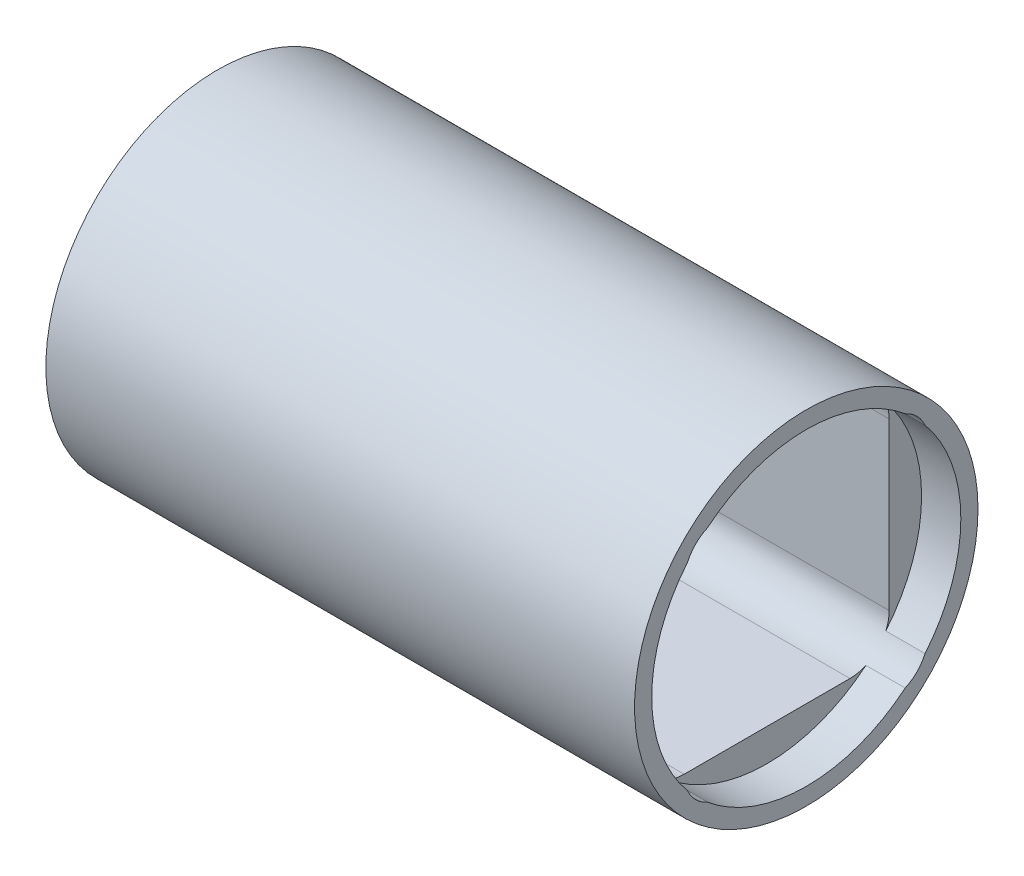
ISO-10303-21;
HEADER;
FILE_DESCRIPTION(('STEP AP214'),'2;1');
FILE_NAME('part.step','',(''),(''),'','','');
FILE_SCHEMA(('AUTOMOTIVE_DESIGN { 1 0 10303 214 1 1 1 1 }'));
ENDSEC;
DATA;
#1=APPLICATION_CONTEXT('core data for automotive mechanical design processes');
#2=APPLICATION_PROTOCOL_DEFINITION('international standard','automotive_design',2000,#1);
#3=PRODUCT_CONTEXT('',#1,'mechanical');
#4=PRODUCT('Part','Part','',(#3));
#5=PRODUCT_RELATED_PRODUCT_CATEGORY('part','',(#4));
#6=PRODUCT_DEFINITION_FORMATION('','',#4);
#7=PRODUCT_DEFINITION_CONTEXT('part definition',#1,'design');
#8=PRODUCT_DEFINITION('design','',#6,#7);
#9=PRODUCT_DEFINITION_SHAPE('','',#8);
#10=(LENGTH_UNIT() NAMED_UNIT(*) SI_UNIT(.MILLI.,.METRE.));
#11=(NAMED_UNIT(*) PLANE_ANGLE_UNIT() SI_UNIT($,.RADIAN.));
#12=(NAMED_UNIT(*) SI_UNIT($,.STERADIAN.) SOLID_ANGLE_UNIT());
#13=UNCERTAINTY_MEASURE_WITH_UNIT(LENGTH_MEASURE(1.E-05),#10,'distance_accuracy_value','');
#14=(GEOMETRIC_REPRESENTATION_CONTEXT(3) GLOBAL_UNCERTAINTY_ASSIGNED_CONTEXT((#13)) GLOBAL_UNIT_ASSIGNED_CONTEXT((#10,
#11,#12)) REPRESENTATION_CONTEXT('',''));
#15=CARTESIAN_POINT('',(0.,0.,0.));
#16=DIRECTION('',(0.,0.,1.));
#17=DIRECTION('',(1.,0.,0.));
#18=AXIS2_PLACEMENT_3D('',#15,#16,#17);
#19=CARTESIAN_POINT('',(56.,0.,0.));
#20=DIRECTION('',(1.,0.,0.));
#21=DIRECTION('',(0.,0.,-1.));
#22=AXIS2_PLACEMENT_3D('',#19,#20,#21);
#23=CYLINDRICAL_SURFACE('',#22,15.75);
#24=DIRECTION('',(-1.,0.,0.));
#25=VECTOR('',#24,1.);
#26=CARTESIAN_POINT('',(56.,10.0776325306588,12.1038763450808));
#27=LINE('',#26,#25);
#28=CARTESIAN_POINT('',(60.,10.0776325306588,12.1038763450808));
#29=VERTEX_POINT('',#28);
#30=CARTESIAN_POINT('',(56.,10.0776325306588,12.1038763450808));
#31=VERTEX_POINT('',#30);
#32=EDGE_CURVE('E264',#29,#31,#27,.T.);
#33=ORIENTED_EDGE('',*,*,#32,.F.);
#34=CARTESIAN_POINT('',(60.,0.,0.));
#35=DIRECTION('',(1.,0.,0.));
#36=DIRECTION('',(0.,0.,-1.));
#37=AXIS2_PLACEMENT_3D('',#34,#35,#36);
#38=CIRCLE('',#37,15.75);
#39=CARTESIAN_POINT('',(60.,-10.0776325306588,12.1038763450808));
#40=VERTEX_POINT('',#39);
#41=EDGE_CURVE('E398',#29,#40,#38,.T.);
#42=ORIENTED_EDGE('',*,*,#41,.T.);
#43=DIRECTION('',(-1.,0.,0.));
#44=VECTOR('',#43,1.);
#45=CARTESIAN_POINT('',(56.,-10.0776325306588,12.1038763450808));
#46=LINE('',#45,#44);
#47=CARTESIAN_POINT('',(56.,-10.0776325306588,12.1038763450808));
#48=VERTEX_POINT('',#47);
#49=EDGE_CURVE('E252',#48,#40,#46,.F.);
#50=ORIENTED_EDGE('',*,*,#49,.F.);
#51=CARTESIAN_POINT('',(56.,0.,0.));
#52=DIRECTION('',(1.,0.,0.));
#53=DIRECTION('',(0.,0.,-1.));
#54=AXIS2_PLACEMENT_3D('',#51,#52,#53);
#55=CIRCLE('',#54,15.75);
#56=EDGE_CURVE('E374',#31,#48,#55,.T.);
#57=ORIENTED_EDGE('',*,*,#56,.F.);
#58=EDGE_LOOP('',(#33,#42,#50,#57));
#59=FACE_BOUND('',#58,.T.);
#60=ADVANCED_FACE('F33',(#59),#23,.F.);
#61=DIRECTION('',(-1.,0.,0.));
#62=VECTOR('',#61,1.);
#63=CARTESIAN_POINT('',(56.,12.1038763450808,10.0776325306588));
#64=LINE('',#63,#62);
#65=CARTESIAN_POINT('',(56.,12.1038763450808,10.0776325306588));
#66=VERTEX_POINT('',#65);
#67=CARTESIAN_POINT('',(60.,12.1038763450808,10.0776325306588));
#68=VERTEX_POINT('',#67);
#69=EDGE_CURVE('E259',#66,#68,#64,.F.);
#70=ORIENTED_EDGE('',*,*,#69,.F.);
#71=CARTESIAN_POINT('',(56.,12.1038763450808,-10.0776325306588));
#72=VERTEX_POINT('',#71);
#73=EDGE_CURVE('E272',#72,#66,#55,.T.);
#74=ORIENTED_EDGE('',*,*,#73,.F.);
#75=DIRECTION('',(-1.,0.,0.));
#76=VECTOR('',#75,1.);
#77=CARTESIAN_POINT('',(56.,12.1038763450808,-10.0776325306588));
#78=LINE('',#77,#76);
#79=CARTESIAN_POINT('',(60.,12.1038763450808,-10.0776325306588));
#80=VERTEX_POINT('',#79);
#81=EDGE_CURVE('E243',#80,#72,#78,.T.);
#82=ORIENTED_EDGE('',*,*,#81,.F.);
#83=EDGE_CURVE('E271',#80,#68,#38,.T.);
#84=ORIENTED_EDGE('',*,*,#83,.T.);
#85=EDGE_LOOP('',(#70,#74,#82,#84));
#86=FACE_BOUND('',#85,.T.);
#87=ADVANCED_FACE('F331',(#86),#23,.F.);
#88=DIRECTION('',(-1.,0.,0.));
#89=VECTOR('',#88,1.);
#90=CARTESIAN_POINT('',(56.,-12.1038763450808,10.0776325306588));
#91=LINE('',#90,#89);
#92=CARTESIAN_POINT('',(60.,-12.1038763450808,10.0776325306588));
#93=VERTEX_POINT('',#92);
#94=CARTESIAN_POINT('',(56.,-12.1038763450808,10.0776325306588));
#95=VERTEX_POINT('',#94);
#96=EDGE_CURVE('E257',#93,#95,#91,.T.);
#97=ORIENTED_EDGE('',*,*,#96,.F.);
#98=CARTESIAN_POINT('',(60.,-12.1038763450808,-10.0776325306588));
#99=VERTEX_POINT('',#98);
#100=EDGE_CURVE('E275',#93,#99,#38,.T.);
#101=ORIENTED_EDGE('',*,*,#100,.T.);
#102=DIRECTION('',(-1.,0.,0.));
#103=VECTOR('',#102,1.);
#104=CARTESIAN_POINT('',(56.,-12.1038763450808,-10.0776325306588));
#105=LINE('',#104,#103);
#106=CARTESIAN_POINT('',(56.,-12.1038763450808,-10.0776325306588));
#107=VERTEX_POINT('',#106);
#108=EDGE_CURVE('E245',#107,#99,#105,.F.);
#109=ORIENTED_EDGE('',*,*,#108,.F.);
#110=EDGE_CURVE('E270',#95,#107,#55,.T.);
#111=ORIENTED_EDGE('',*,*,#110,.F.);
#112=EDGE_LOOP('',(#97,#101,#109,#111));
#113=FACE_BOUND('',#112,.T.);
#114=ADVANCED_FACE('F338',(#113),#23,.F.);
#115=DIRECTION('',(-1.,0.,0.));
#116=VECTOR('',#115,1.);
#117=CARTESIAN_POINT('',(56.,-10.0776325306588,-12.1038763450808));
#118=LINE('',#117,#116);
#119=CARTESIAN_POINT('',(60.,-10.0776325306588,-12.1038763450808));
#120=VERTEX_POINT('',#119);
#121=CARTESIAN_POINT('',(56.,-10.0776325306588,-12.1038763450808));
#122=VERTEX_POINT('',#121);
#123=EDGE_CURVE('E250',#120,#122,#118,.T.);
#124=ORIENTED_EDGE('',*,*,#123,.F.);
#125=CARTESIAN_POINT('',(60.,10.0776325306588,-12.1038763450808));
#126=VERTEX_POINT('',#125);
#127=EDGE_CURVE('E266',#120,#126,#38,.T.);
#128=ORIENTED_EDGE('',*,*,#127,.T.);
#129=DIRECTION('',(-1.,0.,0.));
#130=VECTOR('',#129,1.);
#131=CARTESIAN_POINT('',(56.,10.0776325306588,-12.1038763450808));
#132=LINE('',#131,#130);
#133=CARTESIAN_POINT('',(56.,10.0776325306588,-12.1038763450808));
#134=VERTEX_POINT('',#133);
#135=EDGE_CURVE('E238',#134,#126,#132,.F.);
#136=ORIENTED_EDGE('',*,*,#135,.F.);
#137=EDGE_CURVE('E267',#122,#134,#55,.T.);
#138=ORIENTED_EDGE('',*,*,#137,.F.);
#139=EDGE_LOOP('',(#124,#128,#136,#138));
#140=FACE_BOUND('',#139,.T.);
#141=ADVANCED_FACE('F334',(#140),#23,.F.);
#142=CARTESIAN_POINT('',(56.,0.,0.));
#143=DIRECTION('',(1.,0.,0.));
#144=DIRECTION('',(0.,0.,-1.));
#145=AXIS2_PLACEMENT_3D('',#142,#143,#144);
#146=PLANE('',#145);
#147=DIRECTION('',(0.,1.,0.));
#148=VECTOR('',#147,1.);
#149=CARTESIAN_POINT('',(56.,0.,12.45));
#150=LINE('',#149,#148);
#151=CARTESIAN_POINT('',(56.,-8.45,12.45));
#152=VERTEX_POINT('',#151);
#153=CARTESIAN_POINT('',(56.,8.45,12.45));
#154=VERTEX_POINT('',#153);
#155=EDGE_CURVE('E307',#152,#154,#150,.T.);
#156=ORIENTED_EDGE('',*,*,#155,.T.);
#157=CARTESIAN_POINT('',(56.,8.45,8.45));
#158=DIRECTION('',(1.,0.,0.));
#159=DIRECTION('',(0.,0.,-1.));
#160=AXIS2_PLACEMENT_3D('',#157,#158,#159);
#161=CIRCLE('',#160,4.);
#162=EDGE_CURVE('E292',#154,#31,#161,.F.);
#163=ORIENTED_EDGE('',*,*,#162,.T.);
#164=ORIENTED_EDGE('',*,*,#56,.T.);
#165=CARTESIAN_POINT('',(56.,-8.45,8.45));
#166=DIRECTION('',(1.,0.,0.));
#167=DIRECTION('',(0.,0.,-1.));
#168=AXIS2_PLACEMENT_3D('',#165,#166,#167);
#169=CIRCLE('',#168,4.);
#170=EDGE_CURVE('E306',#48,#152,#169,.F.);
#171=ORIENTED_EDGE('',*,*,#170,.T.);
#172=EDGE_LOOP('',(#156,#163,#164,#171));
#173=FACE_BOUND('',#172,.T.);
#174=ADVANCED_FACE('F344',(#173),#146,.T.);
#175=DIRECTION('',(0.,0.,1.));
#176=VECTOR('',#175,1.);
#177=CARTESIAN_POINT('',(56.,-12.45,0.));
#178=LINE('',#177,#176);
#179=CARTESIAN_POINT('',(56.,-12.45,-8.45));
#180=VERTEX_POINT('',#179);
#181=CARTESIAN_POINT('',(56.,-12.45,8.45));
#182=VERTEX_POINT('',#181);
#183=EDGE_CURVE('E300',#180,#182,#178,.T.);
#184=ORIENTED_EDGE('',*,*,#183,.T.);
#185=EDGE_CURVE('E303',#182,#95,#169,.F.);
#186=ORIENTED_EDGE('',*,*,#185,.T.);
#187=ORIENTED_EDGE('',*,*,#110,.T.);
#188=CARTESIAN_POINT('',(56.,-8.45,-8.45));
#189=DIRECTION('',(1.,0.,0.));
#190=DIRECTION('',(0.,0.,-1.));
#191=AXIS2_PLACEMENT_3D('',#188,#189,#190);
#192=CIRCLE('',#191,4.);
#193=EDGE_CURVE('E299',#107,#180,#192,.F.);
#194=ORIENTED_EDGE('',*,*,#193,.T.);
#195=EDGE_LOOP('',(#184,#186,#187,#194));
#196=FACE_BOUND('',#195,.T.);
#197=ADVANCED_FACE('F350',(#196),#146,.T.);
#198=DIRECTION('',(0.,-1.,0.));
#199=VECTOR('',#198,1.);
#200=CARTESIAN_POINT('',(56.,0.,-12.45));
#201=LINE('',#200,#199);
#202=CARTESIAN_POINT('',(56.,8.45,-12.45));
#203=VERTEX_POINT('',#202);
#204=CARTESIAN_POINT('',(56.,-8.45,-12.45));
#205=VERTEX_POINT('',#204);
#206=EDGE_CURVE('E293',#203,#205,#201,.T.);
#207=ORIENTED_EDGE('',*,*,#206,.T.);
#208=EDGE_CURVE('E296',#205,#122,#192,.F.);
#209=ORIENTED_EDGE('',*,*,#208,.T.);
#210=ORIENTED_EDGE('',*,*,#137,.T.);
#211=CARTESIAN_POINT('',(56.,8.45,-8.45));
#212=DIRECTION('',(1.,0.,0.));
#213=DIRECTION('',(0.,0.,-1.));
#214=AXIS2_PLACEMENT_3D('',#211,#212,#213);
#215=CIRCLE('',#214,4.);
#216=EDGE_CURVE('E289',#134,#203,#215,.F.);
#217=ORIENTED_EDGE('',*,*,#216,.T.);
#218=EDGE_LOOP('',(#207,#209,#210,#217));
#219=FACE_BOUND('',#218,.T.);
#220=ADVANCED_FACE('F416',(#219),#146,.T.);
#221=ORIENTED_EDGE('',*,*,#73,.T.);
#222=CARTESIAN_POINT('',(56.,12.45,8.45));
#223=VERTEX_POINT('',#222);
#224=EDGE_CURVE('E288',#66,#223,#161,.F.);
#225=ORIENTED_EDGE('',*,*,#224,.T.);
#226=DIRECTION('',(0.,0.,-1.));
#227=VECTOR('',#226,1.);
#228=CARTESIAN_POINT('',(56.,12.45,0.));
#229=LINE('',#228,#227);
#230=CARTESIAN_POINT('',(56.,12.45,-8.45));
#231=VERTEX_POINT('',#230);
#232=EDGE_CURVE('E282',#223,#231,#229,.T.);
#233=ORIENTED_EDGE('',*,*,#232,.T.);
#234=EDGE_CURVE('E285',#231,#72,#215,.F.);
#235=ORIENTED_EDGE('',*,*,#234,.T.);
#236=EDGE_LOOP('',(#221,#225,#233,#235));
#237=FACE_BOUND('',#236,.T.);
#238=ADVANCED_FACE('F352',(#237),#146,.T.);
#239=CARTESIAN_POINT('',(0.,0.,0.));
#240=DIRECTION('',(-1.,0.,0.));
#241=DIRECTION('',(0.,0.,1.));
#242=AXIS2_PLACEMENT_3D('',#239,#240,#241);
#243=PLANE('',#242);
#244=DIRECTION('',(0.,1.,0.));
#245=VECTOR('',#244,1.);
#246=CARTESIAN_POINT('',(0.,8.,2.));
#247=LINE('',#246,#245);
#248=CARTESIAN_POINT('',(0.,5.65685424949238,2.));
#249=VERTEX_POINT('',#248);
#250=CARTESIAN_POINT('',(0.,8.,2.));
#251=VERTEX_POINT('',#250);
#252=EDGE_CURVE('E175',#249,#251,#247,.T.);
#253=ORIENTED_EDGE('',*,*,#252,.F.);
#254=CARTESIAN_POINT('',(0.,0.,0.));
#255=DIRECTION('',(-1.,0.,0.));
#256=DIRECTION('',(0.,0.,1.));
#257=AXIS2_PLACEMENT_3D('',#254,#255,#256);
#258=CIRCLE('',#257,6.);
#259=CARTESIAN_POINT('',(0.,5.65685424949238,-2.));
#260=VERTEX_POINT('',#259);
#261=EDGE_CURVE('E188',#260,#249,#258,.T.);
#262=ORIENTED_EDGE('',*,*,#261,.F.);
#263=DIRECTION('',(0.,-1.,0.));
#264=VECTOR('',#263,1.);
#265=CARTESIAN_POINT('',(0.,8.,-2.));
#266=LINE('',#265,#264);
#267=CARTESIAN_POINT('',(0.,8.,-2.));
#268=VERTEX_POINT('',#267);
#269=EDGE_CURVE('E48',#268,#260,#266,.T.);
#270=ORIENTED_EDGE('',*,*,#269,.F.);
#271=DIRECTION('',(0.,0.,-1.));
#272=VECTOR('',#271,1.);
#273=CARTESIAN_POINT('',(0.,8.,-2.));
#274=LINE('',#273,#272);
#275=EDGE_CURVE('E178',#251,#268,#274,.T.);
#276=ORIENTED_EDGE('',*,*,#275,.F.);
#277=EDGE_LOOP('',(#253,#262,#270,#276));
#278=FACE_BOUND('',#277,.T.);
#279=CARTESIAN_POINT('',(0.,0.,0.));
#280=DIRECTION('',(1.,0.,0.));
#281=DIRECTION('',(0.,0.,-1.));
#282=AXIS2_PLACEMENT_3D('',#279,#280,#281);
#283=CIRCLE('',#282,17.5);
#284=CARTESIAN_POINT('',(0.,0.,-17.5));
#285=VERTEX_POINT('',#284);
#286=EDGE_CURVE('E279',#285,#285,#283,.T.);
#287=ORIENTED_EDGE('',*,*,#286,.F.);
#288=EDGE_LOOP('',(#287));
#289=FACE_BOUND('',#288,.T.);
#290=ADVANCED_FACE('F35',(#278,#289),#243,.T.);
#291=CARTESIAN_POINT('',(0.,0.,0.));
#292=DIRECTION('',(1.,0.,0.));
#293=DIRECTION('',(0.,0.,-1.));
#294=AXIS2_PLACEMENT_3D('',#291,#292,#293);
#295=CYLINDRICAL_SURFACE('',#294,17.5);
#296=ORIENTED_EDGE('',*,*,#286,.T.);
#297=EDGE_LOOP('',(#296));
#298=FACE_BOUND('',#297,.T.);
#299=CARTESIAN_POINT('',(60.,0.,0.));
#300=DIRECTION('',(1.,0.,0.));
#301=DIRECTION('',(0.,0.,-1.));
#302=AXIS2_PLACEMENT_3D('',#299,#300,#301);
#303=CIRCLE('',#302,17.5);
#304=CARTESIAN_POINT('',(60.,0.,-17.5));
#305=VERTEX_POINT('',#304);
#306=EDGE_CURVE('E276',#305,#305,#303,.T.);
#307=ORIENTED_EDGE('',*,*,#306,.F.);
#308=EDGE_LOOP('',(#307));
#309=FACE_BOUND('',#308,.T.);
#310=ADVANCED_FACE('F555',(#298,#309),#295,.T.);
#311=CARTESIAN_POINT('',(60.,17.5,0.));
#312=DIRECTION('',(1.,0.,0.));
#313=DIRECTION('',(0.,0.,-1.));
#314=AXIS2_PLACEMENT_3D('',#311,#312,#313);
#315=PLANE('',#314);
#316=ORIENTED_EDGE('',*,*,#41,.F.);
#317=CARTESIAN_POINT('',(60.,8.45,8.45));
#318=DIRECTION('',(1.,0.,0.));
#319=DIRECTION('',(0.,0.,-1.));
#320=AXIS2_PLACEMENT_3D('',#317,#318,#319);
#321=CIRCLE('',#320,4.);
#322=EDGE_CURVE('E261',#29,#68,#321,.F.);
#323=ORIENTED_EDGE('',*,*,#322,.T.);
#324=ORIENTED_EDGE('',*,*,#83,.F.);
#325=CARTESIAN_POINT('',(60.,8.45,-8.45));
#326=DIRECTION('',(1.,0.,0.));
#327=DIRECTION('',(0.,0.,-1.));
#328=AXIS2_PLACEMENT_3D('',#325,#326,#327);
#329=CIRCLE('',#328,4.);
#330=EDGE_CURVE('E240',#80,#126,#329,.F.);
#331=ORIENTED_EDGE('',*,*,#330,.T.);
#332=ORIENTED_EDGE('',*,*,#127,.F.);
#333=CARTESIAN_POINT('',(60.,-8.45,-8.45));
#334=DIRECTION('',(1.,0.,0.));
#335=DIRECTION('',(0.,0.,-1.));
#336=AXIS2_PLACEMENT_3D('',#333,#334,#335);
#337=CIRCLE('',#336,4.);
#338=EDGE_CURVE('E247',#120,#99,#337,.F.);
#339=ORIENTED_EDGE('',*,*,#338,.T.);
#340=ORIENTED_EDGE('',*,*,#100,.F.);
#341=CARTESIAN_POINT('',(60.,-8.45,8.45));
#342=DIRECTION('',(1.,0.,0.));
#343=DIRECTION('',(0.,0.,-1.));
#344=AXIS2_PLACEMENT_3D('',#341,#342,#343);
#345=CIRCLE('',#344,4.);
#346=EDGE_CURVE('E254',#93,#40,#345,.F.);
#347=ORIENTED_EDGE('',*,*,#346,.T.);
#348=EDGE_LOOP('',(#316,#323,#324,#331,#332,#339,#340,#347));
#349=FACE_BOUND('',#348,.T.);
#350=ORIENTED_EDGE('',*,*,#306,.T.);
#351=EDGE_LOOP('',(#350));
#352=FACE_BOUND('',#351,.T.);
#353=ADVANCED_FACE('F361',(#349,#352),#315,.T.);
#354=CARTESIAN_POINT('',(81.,8.45,8.45));
#355=DIRECTION('',(-1.,0.,0.));
#356=DIRECTION('',(0.,0.,1.));
#357=AXIS2_PLACEMENT_3D('',#354,#355,#356);
#358=CYLINDRICAL_SURFACE('',#357,4.);
#359=DIRECTION('',(-1.,0.,0.));
#360=VECTOR('',#359,1.);
#361=CARTESIAN_POINT('',(81.,8.45,12.45));
#362=LINE('',#361,#360);
#363=CARTESIAN_POINT('',(31.,8.45,12.45));
#364=VERTEX_POINT('',#363);
#365=EDGE_CURVE('E236',#154,#364,#362,.T.);
#366=ORIENTED_EDGE('',*,*,#365,.T.);
#367=CARTESIAN_POINT('',(31.,8.45,8.45));
#368=DIRECTION('',(1.,0.,0.));
#369=DIRECTION('',(0.,0.,1.));
#370=AXIS2_PLACEMENT_3D('',#367,#368,#369);
#371=CIRCLE('',#370,4.);
#372=CARTESIAN_POINT('',(31.,12.45,8.45));
#373=VERTEX_POINT('',#372);
#374=EDGE_CURVE('E199',#373,#364,#371,.T.);
#375=ORIENTED_EDGE('',*,*,#374,.F.);
#376=DIRECTION('',(-1.,0.,0.));
#377=VECTOR('',#376,1.);
#378=CARTESIAN_POINT('',(81.,12.45,8.45));
#379=LINE('',#378,#377);
#380=EDGE_CURVE('E223',#223,#373,#379,.T.);
#381=ORIENTED_EDGE('',*,*,#380,.F.);
#382=ORIENTED_EDGE('',*,*,#224,.F.);
#383=ORIENTED_EDGE('',*,*,#69,.T.);
#384=ORIENTED_EDGE('',*,*,#322,.F.);
#385=ORIENTED_EDGE('',*,*,#32,.T.);
#386=ORIENTED_EDGE('',*,*,#162,.F.);
#387=EDGE_LOOP('',(#366,#375,#381,#382,#383,#384,#385,#386));
#388=FACE_BOUND('',#387,.T.);
#389=ADVANCED_FACE('F400',(#388),#358,.F.);
#390=CARTESIAN_POINT('',(81.,8.45,12.45));
#391=DIRECTION('',(0.,0.,-1.));
#392=DIRECTION('',(0.,1.,0.));
#393=AXIS2_PLACEMENT_3D('',#390,#391,#392);
#394=PLANE('',#393);
#395=DIRECTION('',(-1.,0.,0.));
#396=VECTOR('',#395,1.);
#397=CARTESIAN_POINT('',(81.,-8.45,12.45));
#398=LINE('',#397,#396);
#399=CARTESIAN_POINT('',(31.,-8.45,12.45));
#400=VERTEX_POINT('',#399);
#401=EDGE_CURVE('E234',#152,#400,#398,.T.);
#402=ORIENTED_EDGE('',*,*,#401,.T.);
#403=DIRECTION('',(0.,-1.,0.));
#404=VECTOR('',#403,1.);
#405=CARTESIAN_POINT('',(31.,8.45,12.45));
#406=LINE('',#405,#404);
#407=EDGE_CURVE('E202',#364,#400,#406,.T.);
#408=ORIENTED_EDGE('',*,*,#407,.F.);
#409=ORIENTED_EDGE('',*,*,#365,.F.);
#410=ORIENTED_EDGE('',*,*,#155,.F.);
#411=EDGE_LOOP('',(#402,#408,#409,#410));
#412=FACE_BOUND('',#411,.T.);
#413=ADVANCED_FACE('F403',(#412),#394,.T.);
#414=CARTESIAN_POINT('',(81.,-8.45,8.45));
#415=DIRECTION('',(-1.,0.,0.));
#416=DIRECTION('',(0.,0.,1.));
#417=AXIS2_PLACEMENT_3D('',#414,#415,#416);
#418=CYLINDRICAL_SURFACE('',#417,4.);
#419=DIRECTION('',(-1.,0.,0.));
#420=VECTOR('',#419,1.);
#421=CARTESIAN_POINT('',(81.,-12.45,8.45));
#422=LINE('',#421,#420);
#423=CARTESIAN_POINT('',(31.,-12.45,8.45));
#424=VERTEX_POINT('',#423);
#425=EDGE_CURVE('E232',#182,#424,#422,.T.);
#426=ORIENTED_EDGE('',*,*,#425,.T.);
#427=CARTESIAN_POINT('',(31.,-8.45,8.45));
#428=DIRECTION('',(1.,0.,0.));
#429=DIRECTION('',(0.,0.,-1.));
#430=AXIS2_PLACEMENT_3D('',#427,#428,#429);
#431=CIRCLE('',#430,4.);
#432=EDGE_CURVE('E205',#400,#424,#431,.T.);
#433=ORIENTED_EDGE('',*,*,#432,.F.);
#434=ORIENTED_EDGE('',*,*,#401,.F.);
#435=ORIENTED_EDGE('',*,*,#170,.F.);
#436=ORIENTED_EDGE('',*,*,#49,.T.);
#437=ORIENTED_EDGE('',*,*,#346,.F.);
#438=ORIENTED_EDGE('',*,*,#96,.T.);
#439=ORIENTED_EDGE('',*,*,#185,.F.);
#440=EDGE_LOOP('',(#426,#433,#434,#435,#436,#437,#438,#439));
#441=FACE_BOUND('',#440,.T.);
#442=ADVANCED_FACE('F394',(#441),#418,.F.);
#443=CARTESIAN_POINT('',(81.,-12.45,8.45));
#444=DIRECTION('',(0.,1.,0.));
#445=DIRECTION('',(0.,0.,1.));
#446=AXIS2_PLACEMENT_3D('',#443,#444,#445);
#447=PLANE('',#446);
#448=DIRECTION('',(-1.,0.,0.));
#449=VECTOR('',#448,1.);
#450=CARTESIAN_POINT('',(81.,-12.45,-8.45));
#451=LINE('',#450,#449);
#452=CARTESIAN_POINT('',(31.,-12.45,-8.45));
#453=VERTEX_POINT('',#452);
#454=EDGE_CURVE('E230',#180,#453,#451,.T.);
#455=ORIENTED_EDGE('',*,*,#454,.T.);
#456=DIRECTION('',(0.,0.,-1.));
#457=VECTOR('',#456,1.);
#458=CARTESIAN_POINT('',(31.,-12.45,8.45));
#459=LINE('',#458,#457);
#460=EDGE_CURVE('E208',#424,#453,#459,.T.);
#461=ORIENTED_EDGE('',*,*,#460,.F.);
#462=ORIENTED_EDGE('',*,*,#425,.F.);
#463=ORIENTED_EDGE('',*,*,#183,.F.);
#464=EDGE_LOOP('',(#455,#461,#462,#463));
#465=FACE_BOUND('',#464,.T.);
#466=ADVANCED_FACE('F390',(#465),#447,.T.);
#467=CARTESIAN_POINT('',(81.,-8.45,-8.45));
#468=DIRECTION('',(-1.,0.,0.));
#469=DIRECTION('',(0.,0.,1.));
#470=AXIS2_PLACEMENT_3D('',#467,#468,#469);
#471=CYLINDRICAL_SURFACE('',#470,4.);
#472=DIRECTION('',(-1.,0.,0.));
#473=VECTOR('',#472,1.);
#474=CARTESIAN_POINT('',(81.,-8.45,-12.45));
#475=LINE('',#474,#473);
#476=CARTESIAN_POINT('',(31.,-8.45,-12.45));
#477=VERTEX_POINT('',#476);
#478=EDGE_CURVE('E228',#205,#477,#475,.T.);
#479=ORIENTED_EDGE('',*,*,#478,.T.);
#480=CARTESIAN_POINT('',(31.,-8.45,-8.45));
#481=DIRECTION('',(1.,0.,0.));
#482=DIRECTION('',(0.,0.,1.));
#483=AXIS2_PLACEMENT_3D('',#480,#481,#482);
#484=CIRCLE('',#483,4.);
#485=EDGE_CURVE('E211',#453,#477,#484,.T.);
#486=ORIENTED_EDGE('',*,*,#485,.F.);
#487=ORIENTED_EDGE('',*,*,#454,.F.);
#488=ORIENTED_EDGE('',*,*,#193,.F.);
#489=ORIENTED_EDGE('',*,*,#108,.T.);
#490=ORIENTED_EDGE('',*,*,#338,.F.);
#491=ORIENTED_EDGE('',*,*,#123,.T.);
#492=ORIENTED_EDGE('',*,*,#208,.F.);
#493=EDGE_LOOP('',(#479,#486,#487,#488,#489,#490,#491,#492));
#494=FACE_BOUND('',#493,.T.);
#495=ADVANCED_FACE('F385',(#494),#471,.F.);
#496=CARTESIAN_POINT('',(81.,8.45,-12.45));
#497=DIRECTION('',(0.,0.,1.));
#498=DIRECTION('',(1.,0.,0.));
#499=AXIS2_PLACEMENT_3D('',#496,#497,#498);
#500=PLANE('',#499);
#501=DIRECTION('',(-1.,0.,0.));
#502=VECTOR('',#501,1.);
#503=CARTESIAN_POINT('',(81.,8.45,-12.45));
#504=LINE('',#503,#502);
#505=CARTESIAN_POINT('',(31.,8.45,-12.45));
#506=VERTEX_POINT('',#505);
#507=EDGE_CURVE('E226',#203,#506,#504,.T.);
#508=ORIENTED_EDGE('',*,*,#507,.T.);
#509=DIRECTION('',(0.,1.,0.));
#510=VECTOR('',#509,1.);
#511=CARTESIAN_POINT('',(31.,8.45,-12.45));
#512=LINE('',#511,#510);
#513=EDGE_CURVE('E214',#477,#506,#512,.T.);
#514=ORIENTED_EDGE('',*,*,#513,.F.);
#515=ORIENTED_EDGE('',*,*,#478,.F.);
#516=ORIENTED_EDGE('',*,*,#206,.F.);
#517=EDGE_LOOP('',(#508,#514,#515,#516));
#518=FACE_BOUND('',#517,.T.);
#519=ADVANCED_FACE('F414',(#518),#500,.T.);
#520=CARTESIAN_POINT('',(81.,8.45,-8.45));
#521=DIRECTION('',(-1.,0.,0.));
#522=DIRECTION('',(0.,0.,1.));
#523=AXIS2_PLACEMENT_3D('',#520,#521,#522);
#524=CYLINDRICAL_SURFACE('',#523,4.);
#525=DIRECTION('',(-1.,0.,0.));
#526=VECTOR('',#525,1.);
#527=CARTESIAN_POINT('',(81.,12.45,-8.45));
#528=LINE('',#527,#526);
#529=CARTESIAN_POINT('',(31.,12.45,-8.45));
#530=VERTEX_POINT('',#529);
#531=EDGE_CURVE('E56',#231,#530,#528,.T.);
#532=ORIENTED_EDGE('',*,*,#531,.T.);
#533=CARTESIAN_POINT('',(31.,8.45,-8.45));
#534=DIRECTION('',(1.,0.,0.));
#535=DIRECTION('',(0.,0.,1.));
#536=AXIS2_PLACEMENT_3D('',#533,#534,#535);
#537=CIRCLE('',#536,4.);
#538=EDGE_CURVE('E217',#506,#530,#537,.T.);
#539=ORIENTED_EDGE('',*,*,#538,.F.);
#540=ORIENTED_EDGE('',*,*,#507,.F.);
#541=ORIENTED_EDGE('',*,*,#216,.F.);
#542=ORIENTED_EDGE('',*,*,#135,.T.);
#543=ORIENTED_EDGE('',*,*,#330,.F.);
#544=ORIENTED_EDGE('',*,*,#81,.T.);
#545=ORIENTED_EDGE('',*,*,#234,.F.);
#546=EDGE_LOOP('',(#532,#539,#540,#541,#542,#543,#544,#545));
#547=FACE_BOUND('',#546,.T.);
#548=ADVANCED_FACE('F369',(#547),#524,.F.);
#549=CARTESIAN_POINT('',(81.,12.45,8.45));
#550=DIRECTION('',(0.,-1.,0.));
#551=DIRECTION('',(0.,0.,-1.));
#552=AXIS2_PLACEMENT_3D('',#549,#550,#551);
#553=PLANE('',#552);
#554=ORIENTED_EDGE('',*,*,#380,.T.);
#555=DIRECTION('',(0.,0.,1.));
#556=VECTOR('',#555,1.);
#557=CARTESIAN_POINT('',(31.,12.45,8.45));
#558=LINE('',#557,#556);
#559=EDGE_CURVE('E220',#530,#373,#558,.T.);
#560=ORIENTED_EDGE('',*,*,#559,.F.);
#561=ORIENTED_EDGE('',*,*,#531,.F.);
#562=ORIENTED_EDGE('',*,*,#232,.F.);
#563=EDGE_LOOP('',(#554,#560,#561,#562));
#564=FACE_BOUND('',#563,.T.);
#565=ADVANCED_FACE('F408',(#564),#553,.T.);
#566=CARTESIAN_POINT('',(31.,8.45,8.45));
#567=DIRECTION('',(-1.,0.,0.));
#568=DIRECTION('',(0.,0.,1.));
#569=AXIS2_PLACEMENT_3D('',#566,#567,#568);
#570=PLANE('',#569);
#571=CARTESIAN_POINT('',(31.,0.,0.));
#572=DIRECTION('',(-1.,0.,0.));
#573=DIRECTION('',(0.,0.,1.));
#574=AXIS2_PLACEMENT_3D('',#571,#572,#573);
#575=CIRCLE('',#574,6.);
#576=CARTESIAN_POINT('',(31.,5.65685424949238,-2.));
#577=VERTEX_POINT('',#576);
#578=CARTESIAN_POINT('',(31.,5.65685424949238,2.));
#579=VERTEX_POINT('',#578);
#580=EDGE_CURVE('E198',#577,#579,#575,.T.);
#581=ORIENTED_EDGE('',*,*,#580,.T.);
#582=DIRECTION('',(0.,1.,0.));
#583=VECTOR('',#582,1.);
#584=CARTESIAN_POINT('',(31.,8.45,2.));
#585=LINE('',#584,#583);
#586=CARTESIAN_POINT('',(31.,8.,2.));
#587=VERTEX_POINT('',#586);
#588=EDGE_CURVE('E194',#579,#587,#585,.T.);
#589=ORIENTED_EDGE('',*,*,#588,.T.);
#590=DIRECTION('',(0.,0.,-1.));
#591=VECTOR('',#590,1.);
#592=CARTESIAN_POINT('',(31.,8.,8.45));
#593=LINE('',#592,#591);
#594=CARTESIAN_POINT('',(31.,8.,-2.));
#595=VERTEX_POINT('',#594);
#596=EDGE_CURVE('E11',#587,#595,#593,.T.);
#597=ORIENTED_EDGE('',*,*,#596,.T.);
#598=DIRECTION('',(0.,-1.,0.));
#599=VECTOR('',#598,1.);
#600=CARTESIAN_POINT('',(31.,8.45,-2.));
#601=LINE('',#600,#599);
#602=EDGE_CURVE('E172',#595,#577,#601,.T.);
#603=ORIENTED_EDGE('',*,*,#602,.T.);
#604=EDGE_LOOP('',(#581,#589,#597,#603));
#605=FACE_BOUND('',#604,.T.);
#606=ORIENTED_EDGE('',*,*,#374,.T.);
#607=ORIENTED_EDGE('',*,*,#407,.T.);
#608=ORIENTED_EDGE('',*,*,#432,.T.);
#609=ORIENTED_EDGE('',*,*,#460,.T.);
#610=ORIENTED_EDGE('',*,*,#485,.T.);
#611=ORIENTED_EDGE('',*,*,#513,.T.);
#612=ORIENTED_EDGE('',*,*,#538,.T.);
#613=ORIENTED_EDGE('',*,*,#559,.T.);
#614=EDGE_LOOP('',(#606,#607,#608,#609,#610,#611,#612,#613));
#615=FACE_BOUND('',#614,.T.);
#616=ADVANCED_FACE('F319',(#605,#615),#570,.F.);
#617=CARTESIAN_POINT('',(60.,0.,0.));
#618=DIRECTION('',(-1.,0.,0.));
#619=DIRECTION('',(0.,0.,1.));
#620=AXIS2_PLACEMENT_3D('',#617,#618,#619);
#621=CYLINDRICAL_SURFACE('',#620,6.);
#622=ORIENTED_EDGE('',*,*,#261,.T.);
#623=DIRECTION('',(-1.,0.,0.));
#624=VECTOR('',#623,1.);
#625=CARTESIAN_POINT('',(60.,5.65685424949238,2.));
#626=LINE('',#625,#624);
#627=EDGE_CURVE('E41',#249,#579,#626,.F.);
#628=ORIENTED_EDGE('',*,*,#627,.T.);
#629=ORIENTED_EDGE('',*,*,#580,.F.);
#630=DIRECTION('',(-1.,0.,0.));
#631=VECTOR('',#630,1.);
#632=CARTESIAN_POINT('',(60.,5.65685424949238,-2.));
#633=LINE('',#632,#631);
#634=EDGE_CURVE('E312',#577,#260,#633,.T.);
#635=ORIENTED_EDGE('',*,*,#634,.T.);
#636=EDGE_LOOP('',(#622,#628,#629,#635));
#637=FACE_BOUND('',#636,.T.);
#638=ADVANCED_FACE('F316',(#637),#621,.F.);
#639=CARTESIAN_POINT('',(60.,8.,-2.));
#640=DIRECTION('',(0.,1.,0.));
#641=DIRECTION('',(0.,0.,1.));
#642=AXIS2_PLACEMENT_3D('',#639,#640,#641);
#643=PLANE('',#642);
#644=DIRECTION('',(-1.,0.,0.));
#645=VECTOR('',#644,1.);
#646=CARTESIAN_POINT('',(60.,8.,2.));
#647=LINE('',#646,#645);
#648=EDGE_CURVE('E174',#587,#251,#647,.T.);
#649=ORIENTED_EDGE('',*,*,#648,.T.);
#650=ORIENTED_EDGE('',*,*,#275,.T.);
#651=DIRECTION('',(-1.,0.,0.));
#652=VECTOR('',#651,1.);
#653=CARTESIAN_POINT('',(60.,8.,-2.));
#654=LINE('',#653,#652);
#655=EDGE_CURVE('E168',#595,#268,#654,.T.);
#656=ORIENTED_EDGE('',*,*,#655,.F.);
#657=ORIENTED_EDGE('',*,*,#596,.F.);
#658=EDGE_LOOP('',(#649,#650,#656,#657));
#659=FACE_BOUND('',#658,.T.);
#660=ADVANCED_FACE('F179',(#659),#643,.F.);
#661=CARTESIAN_POINT('',(60.,8.,2.));
#662=DIRECTION('',(0.,0.,1.));
#663=DIRECTION('',(1.,0.,0.));
#664=AXIS2_PLACEMENT_3D('',#661,#662,#663);
#665=PLANE('',#664);
#666=ORIENTED_EDGE('',*,*,#627,.F.);
#667=ORIENTED_EDGE('',*,*,#252,.T.);
#668=ORIENTED_EDGE('',*,*,#648,.F.);
#669=ORIENTED_EDGE('',*,*,#588,.F.);
#670=EDGE_LOOP('',(#666,#667,#668,#669));
#671=FACE_BOUND('',#670,.T.);
#672=ADVANCED_FACE('F321',(#671),#665,.F.);
#673=CARTESIAN_POINT('',(60.,8.,-2.));
#674=DIRECTION('',(0.,0.,-1.));
#675=DIRECTION('',(-1.,0.,0.));
#676=AXIS2_PLACEMENT_3D('',#673,#674,#675);
#677=PLANE('',#676);
#678=ORIENTED_EDGE('',*,*,#655,.T.);
#679=ORIENTED_EDGE('',*,*,#269,.T.);
#680=ORIENTED_EDGE('',*,*,#634,.F.);
#681=ORIENTED_EDGE('',*,*,#602,.F.);
#682=EDGE_LOOP('',(#678,#679,#680,#681));
#683=FACE_BOUND('',#682,.T.);
#684=ADVANCED_FACE('F170',(#683),#677,.F.);
#685=CLOSED_SHELL('',(#60,#87,#114,#141,#174,#197,#220,#238,#290,#310,#353,#389,#413,#442,#466,
#495,#519,#548,#565,#616,#638,#660,#672,#684));
#686=MANIFOLD_SOLID_BREP('B2',#685);
#687=ADVANCED_BREP_SHAPE_REPRESENTATION('',(#18,#686),#14);
#688=SHAPE_DEFINITION_REPRESENTATION(#9,#687);
ENDSEC;
END-ISO-10303-21;
